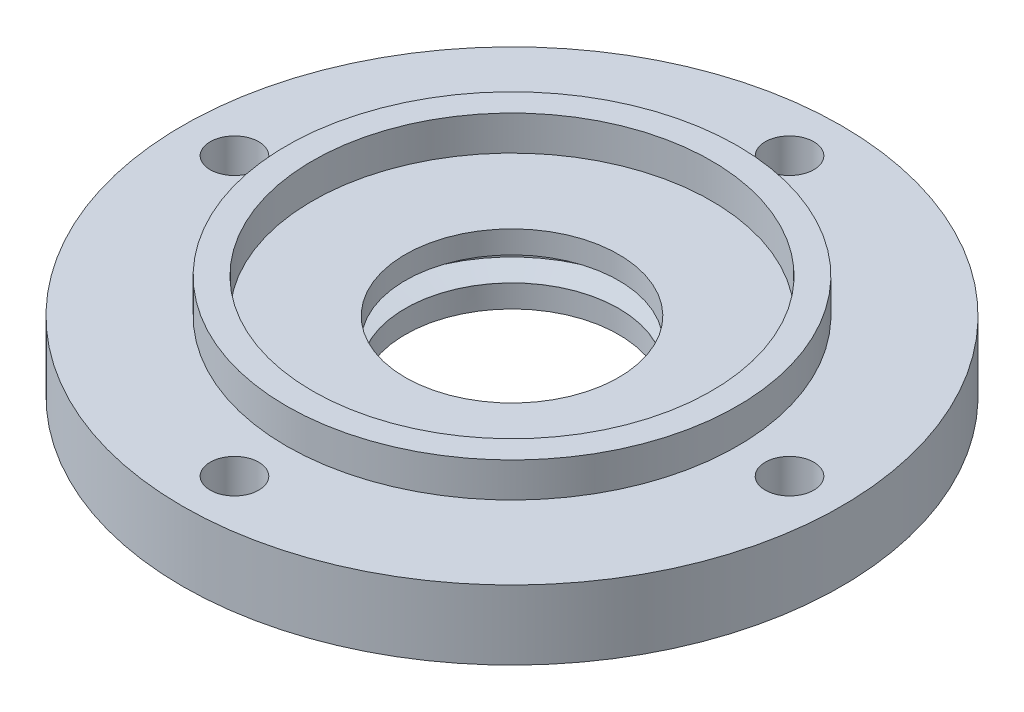
ISO-10303-21;
HEADER;
FILE_DESCRIPTION(('STEP AP214'),'2;1');
FILE_NAME('part.step','',(''),(''),'','','');
FILE_SCHEMA(('AUTOMOTIVE_DESIGN { 1 0 10303 214 1 1 1 1 }'));
ENDSEC;
DATA;
#1=APPLICATION_CONTEXT('core data for automotive mechanical design processes');
#2=APPLICATION_PROTOCOL_DEFINITION('international standard','automotive_design',2000,#1);
#3=PRODUCT_CONTEXT('',#1,'mechanical');
#4=PRODUCT('Part','Part','',(#3));
#5=PRODUCT_RELATED_PRODUCT_CATEGORY('part','',(#4));
#6=PRODUCT_DEFINITION_FORMATION('','',#4);
#7=PRODUCT_DEFINITION_CONTEXT('part definition',#1,'design');
#8=PRODUCT_DEFINITION('design','',#6,#7);
#9=PRODUCT_DEFINITION_SHAPE('','',#8);
#10=(LENGTH_UNIT() NAMED_UNIT(*) SI_UNIT(.MILLI.,.METRE.));
#11=(NAMED_UNIT(*) PLANE_ANGLE_UNIT() SI_UNIT($,.RADIAN.));
#12=(NAMED_UNIT(*) SI_UNIT($,.STERADIAN.) SOLID_ANGLE_UNIT());
#13=UNCERTAINTY_MEASURE_WITH_UNIT(LENGTH_MEASURE(1.E-05),#10,'distance_accuracy_value','');
#14=(GEOMETRIC_REPRESENTATION_CONTEXT(3) GLOBAL_UNCERTAINTY_ASSIGNED_CONTEXT((#13)) GLOBAL_UNIT_ASSIGNED_CONTEXT((#10,
#11,#12)) REPRESENTATION_CONTEXT('',''));
#15=CARTESIAN_POINT('',(0.,0.,0.));
#16=DIRECTION('',(0.,0.,1.));
#17=DIRECTION('',(1.,0.,0.));
#18=AXIS2_PLACEMENT_3D('',#15,#16,#17);
#19=CARTESIAN_POINT('',(0.,-10.,0.));
#20=DIRECTION('',(0.,1.,0.));
#21=DIRECTION('',(0.,0.,1.));
#22=AXIS2_PLACEMENT_3D('',#19,#20,#21);
#23=CYLINDRICAL_SURFACE('',#22,30.75);
#24=CARTESIAN_POINT('',(0.,3.5,0.));
#25=DIRECTION('',(0.,1.,0.));
#26=DIRECTION('',(0.,0.,1.));
#27=AXIS2_PLACEMENT_3D('',#24,#25,#26);
#28=CIRCLE('',#27,30.75);
#29=CARTESIAN_POINT('',(0.,3.49999999999999,30.75));
#30=VERTEX_POINT('',#29);
#31=EDGE_CURVE('E41',#30,#30,#28,.F.);
#32=ORIENTED_EDGE('',*,*,#31,.T.);
#33=EDGE_LOOP('',(#32));
#34=FACE_BOUND('',#33,.T.);
#35=CARTESIAN_POINT('',(0.,10.,0.));
#36=DIRECTION('',(0.,1.,0.));
#37=DIRECTION('',(0.,0.,1.));
#38=AXIS2_PLACEMENT_3D('',#35,#36,#37);
#39=CIRCLE('',#38,30.75);
#40=CARTESIAN_POINT('',(0.,10.,30.75));
#41=VERTEX_POINT('',#40);
#42=EDGE_CURVE('E63',#41,#41,#39,.T.);
#43=ORIENTED_EDGE('',*,*,#42,.T.);
#44=EDGE_LOOP('',(#43));
#45=FACE_BOUND('',#44,.T.);
#46=ADVANCED_FACE('F37',(#34,#45),#23,.F.);
#47=CARTESIAN_POINT('',(0.,10.,0.));
#48=DIRECTION('',(0.,-1.,0.));
#49=DIRECTION('',(0.,0.,-1.));
#50=AXIS2_PLACEMENT_3D('',#47,#48,#49);
#51=CYLINDRICAL_SURFACE('',#50,95.);
#52=CARTESIAN_POINT('',(0.,10.,0.));
#53=DIRECTION('',(0.,1.,0.));
#54=DIRECTION('',(0.,0.,1.));
#55=AXIS2_PLACEMENT_3D('',#52,#53,#54);
#56=CIRCLE('',#55,95.);
#57=CARTESIAN_POINT('',(0.,10.,95.));
#58=VERTEX_POINT('',#57);
#59=EDGE_CURVE('E45',#58,#58,#56,.T.);
#60=ORIENTED_EDGE('',*,*,#59,.F.);
#61=EDGE_LOOP('',(#60));
#62=FACE_BOUND('',#61,.T.);
#63=CARTESIAN_POINT('',(0.,-10.,0.));
#64=DIRECTION('',(0.,1.,0.));
#65=DIRECTION('',(0.,0.,1.));
#66=AXIS2_PLACEMENT_3D('',#63,#64,#65);
#67=CIRCLE('',#66,95.);
#68=CARTESIAN_POINT('',(0.,-10.,95.));
#69=VERTEX_POINT('',#68);
#70=EDGE_CURVE('E50',#69,#69,#67,.T.);
#71=ORIENTED_EDGE('',*,*,#70,.T.);
#72=EDGE_LOOP('',(#71));
#73=FACE_BOUND('',#72,.T.);
#74=ADVANCED_FACE('F39',(#62,#73),#51,.T.);
#75=CARTESIAN_POINT('',(0.,10.,0.));
#76=DIRECTION('',(0.,1.,0.));
#77=DIRECTION('',(0.,0.,1.));
#78=AXIS2_PLACEMENT_3D('',#75,#76,#77);
#79=PLANE('',#78);
#80=CARTESIAN_POINT('',(0.,10.,-80.));
#81=DIRECTION('',(0.,1.,0.));
#82=DIRECTION('',(0.,0.,1.));
#83=AXIS2_PLACEMENT_3D('',#80,#81,#82);
#84=CIRCLE('',#83,7.);
#85=CARTESIAN_POINT('',(0.,10.,-73.));
#86=VERTEX_POINT('',#85);
#87=EDGE_CURVE('E84',#86,#86,#84,.T.);
#88=ORIENTED_EDGE('',*,*,#87,.F.);
#89=EDGE_LOOP('',(#88));
#90=FACE_BOUND('',#89,.T.);
#91=CARTESIAN_POINT('',(80.0000000000023,10.,-2.26393958003914E-12));
#92=DIRECTION('',(0.,1.,0.));
#93=DIRECTION('',(0.,0.,1.));
#94=AXIS2_PLACEMENT_3D('',#91,#92,#93);
#95=CIRCLE('',#94,7.00000000000177);
#96=CARTESIAN_POINT('',(80.0000000000023,10.,6.99999999999951));
#97=VERTEX_POINT('',#96);
#98=EDGE_CURVE('E90',#97,#97,#95,.T.);
#99=ORIENTED_EDGE('',*,*,#98,.F.);
#100=EDGE_LOOP('',(#99));
#101=FACE_BOUND('',#100,.T.);
#102=CARTESIAN_POINT('',(4.52787916007828E-12,10.,80.));
#103=DIRECTION('',(0.,1.,0.));
#104=DIRECTION('',(0.,0.,1.));
#105=AXIS2_PLACEMENT_3D('',#102,#103,#104);
#106=CIRCLE('',#105,7.00000000000487);
#107=CARTESIAN_POINT('',(4.52787916007828E-12,10.,87.0000000000049));
#108=VERTEX_POINT('',#107);
#109=EDGE_CURVE('E96',#108,#108,#106,.T.);
#110=ORIENTED_EDGE('',*,*,#109,.F.);
#111=EDGE_LOOP('',(#110));
#112=FACE_BOUND('',#111,.T.);
#113=CARTESIAN_POINT('',(-79.9999999999977,10.,2.27373675443232E-12));
#114=DIRECTION('',(0.,1.,0.));
#115=DIRECTION('',(0.,0.,1.));
#116=AXIS2_PLACEMENT_3D('',#113,#114,#115);
#117=CIRCLE('',#116,7.00000000000364);
#118=CARTESIAN_POINT('',(-79.9999999999977,10.,7.00000000000591));
#119=VERTEX_POINT('',#118);
#120=EDGE_CURVE('E77',#119,#119,#117,.T.);
#121=ORIENTED_EDGE('',*,*,#120,.F.);
#122=EDGE_LOOP('',(#121));
#123=FACE_BOUND('',#122,.T.);
#124=CARTESIAN_POINT('',(0.,10.,0.));
#125=DIRECTION('',(0.,1.,0.));
#126=DIRECTION('',(0.,0.,1.));
#127=AXIS2_PLACEMENT_3D('',#124,#125,#126);
#128=CIRCLE('',#127,65.);
#129=CARTESIAN_POINT('',(0.,10.,65.));
#130=VERTEX_POINT('',#129);
#131=EDGE_CURVE('E10',#130,#130,#128,.T.);
#132=ORIENTED_EDGE('',*,*,#131,.F.);
#133=EDGE_LOOP('',(#132));
#134=FACE_BOUND('',#133,.T.);
#135=ORIENTED_EDGE('',*,*,#59,.T.);
#136=EDGE_LOOP('',(#135));
#137=FACE_BOUND('',#136,.T.);
#138=ADVANCED_FACE('F126',(#90,#101,#112,#123,#134,#137),#79,.T.);
#139=CARTESIAN_POINT('',(0.,-10.,0.));
#140=DIRECTION('',(0.,1.,0.));
#141=DIRECTION('',(0.,0.,1.));
#142=AXIS2_PLACEMENT_3D('',#139,#140,#141);
#143=PLANE('',#142);
#144=CARTESIAN_POINT('',(0.,-10.,0.));
#145=DIRECTION('',(0.,1.,0.));
#146=DIRECTION('',(0.,0.,1.));
#147=AXIS2_PLACEMENT_3D('',#144,#145,#146);
#148=CIRCLE('',#147,30.75);
#149=CARTESIAN_POINT('',(0.,-10.,30.75));
#150=VERTEX_POINT('',#149);
#151=EDGE_CURVE('E74',#150,#150,#148,.T.);
#152=ORIENTED_EDGE('',*,*,#151,.T.);
#153=EDGE_LOOP('',(#152));
#154=FACE_BOUND('',#153,.T.);
#155=CARTESIAN_POINT('',(0.,-10.,-80.));
#156=DIRECTION('',(0.,1.,0.));
#157=DIRECTION('',(0.,0.,1.));
#158=AXIS2_PLACEMENT_3D('',#155,#156,#157);
#159=CIRCLE('',#158,7.);
#160=CARTESIAN_POINT('',(0.,-10.,-73.));
#161=VERTEX_POINT('',#160);
#162=EDGE_CURVE('E80',#161,#161,#159,.T.);
#163=ORIENTED_EDGE('',*,*,#162,.T.);
#164=EDGE_LOOP('',(#163));
#165=FACE_BOUND('',#164,.T.);
#166=CARTESIAN_POINT('',(80.0000000000023,-10.,-2.26393958003914E-12));
#167=DIRECTION('',(0.,1.,0.));
#168=DIRECTION('',(0.,0.,1.));
#169=AXIS2_PLACEMENT_3D('',#166,#167,#168);
#170=CIRCLE('',#169,7.00000000000177);
#171=CARTESIAN_POINT('',(80.0000000000023,-10.,6.99999999999951));
#172=VERTEX_POINT('',#171);
#173=EDGE_CURVE('E87',#172,#172,#170,.T.);
#174=ORIENTED_EDGE('',*,*,#173,.T.);
#175=EDGE_LOOP('',(#174));
#176=FACE_BOUND('',#175,.T.);
#177=CARTESIAN_POINT('',(4.52787916007828E-12,-10.,80.));
#178=DIRECTION('',(0.,1.,0.));
#179=DIRECTION('',(0.,0.,1.));
#180=AXIS2_PLACEMENT_3D('',#177,#178,#179);
#181=CIRCLE('',#180,7.00000000000487);
#182=CARTESIAN_POINT('',(4.52787916007828E-12,-10.,87.0000000000049));
#183=VERTEX_POINT('',#182);
#184=EDGE_CURVE('E93',#183,#183,#181,.T.);
#185=ORIENTED_EDGE('',*,*,#184,.T.);
#186=EDGE_LOOP('',(#185));
#187=FACE_BOUND('',#186,.T.);
#188=CARTESIAN_POINT('',(-79.9999999999977,-10.,2.27373675443232E-12));
#189=DIRECTION('',(0.,1.,0.));
#190=DIRECTION('',(0.,0.,1.));
#191=AXIS2_PLACEMENT_3D('',#188,#189,#190);
#192=CIRCLE('',#191,7.00000000000364);
#193=CARTESIAN_POINT('',(-79.9999999999977,-10.,7.00000000000591));
#194=VERTEX_POINT('',#193);
#195=EDGE_CURVE('E99',#194,#194,#192,.T.);
#196=ORIENTED_EDGE('',*,*,#195,.T.);
#197=EDGE_LOOP('',(#196));
#198=FACE_BOUND('',#197,.T.);
#199=ORIENTED_EDGE('',*,*,#70,.F.);
#200=EDGE_LOOP('',(#199));
#201=FACE_BOUND('',#200,.T.);
#202=ADVANCED_FACE('F120',(#154,#165,#176,#187,#198,#201),#143,.F.);
#203=CARTESIAN_POINT('',(0.,20.,0.));
#204=DIRECTION('',(0.,-1.,0.));
#205=DIRECTION('',(0.,0.,-1.));
#206=AXIS2_PLACEMENT_3D('',#203,#204,#205);
#207=CYLINDRICAL_SURFACE('',#206,65.);
#208=CARTESIAN_POINT('',(0.,20.,0.));
#209=DIRECTION('',(0.,1.,0.));
#210=DIRECTION('',(0.,0.,1.));
#211=AXIS2_PLACEMENT_3D('',#208,#209,#210);
#212=CIRCLE('',#211,65.);
#213=CARTESIAN_POINT('',(0.,20.,65.));
#214=VERTEX_POINT('',#213);
#215=EDGE_CURVE('E53',#214,#214,#212,.T.);
#216=ORIENTED_EDGE('',*,*,#215,.F.);
#217=EDGE_LOOP('',(#216));
#218=FACE_BOUND('',#217,.T.);
#219=ORIENTED_EDGE('',*,*,#131,.T.);
#220=EDGE_LOOP('',(#219));
#221=FACE_BOUND('',#220,.T.);
#222=ADVANCED_FACE('F114',(#218,#221),#207,.T.);
#223=CARTESIAN_POINT('',(0.,20.,0.));
#224=DIRECTION('',(0.,1.,0.));
#225=DIRECTION('',(0.,0.,1.));
#226=AXIS2_PLACEMENT_3D('',#223,#224,#225);
#227=PLANE('',#226);
#228=CARTESIAN_POINT('',(0.,20.,0.));
#229=DIRECTION('',(0.,1.,0.));
#230=DIRECTION('',(0.,0.,1.));
#231=AXIS2_PLACEMENT_3D('',#228,#229,#230);
#232=CIRCLE('',#231,57.5);
#233=CARTESIAN_POINT('',(0.,20.,57.5));
#234=VERTEX_POINT('',#233);
#235=EDGE_CURVE('E83',#234,#234,#232,.T.);
#236=ORIENTED_EDGE('',*,*,#235,.F.);
#237=EDGE_LOOP('',(#236));
#238=FACE_BOUND('',#237,.T.);
#239=ORIENTED_EDGE('',*,*,#215,.T.);
#240=EDGE_LOOP('',(#239));
#241=FACE_BOUND('',#240,.T.);
#242=ADVANCED_FACE('F111',(#238,#241),#227,.T.);
#243=CARTESIAN_POINT('',(0.,10.,0.));
#244=DIRECTION('',(0.,1.,0.));
#245=DIRECTION('',(0.,0.,1.));
#246=AXIS2_PLACEMENT_3D('',#243,#244,#245);
#247=CYLINDRICAL_SURFACE('',#246,57.5);
#248=CARTESIAN_POINT('',(0.,10.,0.));
#249=DIRECTION('',(0.,1.,0.));
#250=DIRECTION('',(0.,0.,1.));
#251=AXIS2_PLACEMENT_3D('',#248,#249,#250);
#252=CIRCLE('',#251,57.5);
#253=CARTESIAN_POINT('',(0.,10.,57.5));
#254=VERTEX_POINT('',#253);
#255=EDGE_CURVE('E104',#254,#254,#252,.T.);
#256=ORIENTED_EDGE('',*,*,#255,.F.);
#257=EDGE_LOOP('',(#256));
#258=FACE_BOUND('',#257,.T.);
#259=ORIENTED_EDGE('',*,*,#235,.T.);
#260=EDGE_LOOP('',(#259));
#261=FACE_BOUND('',#260,.T.);
#262=ADVANCED_FACE('F109',(#258,#261),#247,.F.);
#263=CARTESIAN_POINT('',(0.,10.,0.));
#264=DIRECTION('',(0.,1.,0.));
#265=DIRECTION('',(0.,0.,1.));
#266=AXIS2_PLACEMENT_3D('',#263,#264,#265);
#267=PLANE('',#266);
#268=ORIENTED_EDGE('',*,*,#42,.F.);
#269=EDGE_LOOP('',(#268));
#270=FACE_BOUND('',#269,.T.);
#271=ORIENTED_EDGE('',*,*,#255,.T.);
#272=EDGE_LOOP('',(#271));
#273=FACE_BOUND('',#272,.T.);
#274=ADVANCED_FACE('F170',(#270,#273),#267,.T.);
#275=CARTESIAN_POINT('',(-79.9999999999977,-10.,2.27373675443232E-12));
#276=DIRECTION('',(0.,1.,0.));
#277=DIRECTION('',(0.,0.,1.));
#278=AXIS2_PLACEMENT_3D('',#275,#276,#277);
#279=CYLINDRICAL_SURFACE('',#278,7.00000000000364);
#280=ORIENTED_EDGE('',*,*,#195,.F.);
#281=EDGE_LOOP('',(#280));
#282=FACE_BOUND('',#281,.T.);
#283=ORIENTED_EDGE('',*,*,#120,.T.);
#284=EDGE_LOOP('',(#283));
#285=FACE_BOUND('',#284,.T.);
#286=ADVANCED_FACE('F166',(#282,#285),#279,.F.);
#287=CARTESIAN_POINT('',(4.52787916007828E-12,-10.,80.));
#288=DIRECTION('',(0.,1.,0.));
#289=DIRECTION('',(0.,0.,1.));
#290=AXIS2_PLACEMENT_3D('',#287,#288,#289);
#291=CYLINDRICAL_SURFACE('',#290,7.00000000000487);
#292=ORIENTED_EDGE('',*,*,#184,.F.);
#293=EDGE_LOOP('',(#292));
#294=FACE_BOUND('',#293,.T.);
#295=ORIENTED_EDGE('',*,*,#109,.T.);
#296=EDGE_LOOP('',(#295));
#297=FACE_BOUND('',#296,.T.);
#298=ADVANCED_FACE('F169',(#294,#297),#291,.F.);
#299=CARTESIAN_POINT('',(80.0000000000023,-10.,-2.26393958003914E-12));
#300=DIRECTION('',(0.,1.,0.));
#301=DIRECTION('',(0.,0.,1.));
#302=AXIS2_PLACEMENT_3D('',#299,#300,#301);
#303=CYLINDRICAL_SURFACE('',#302,7.00000000000177);
#304=ORIENTED_EDGE('',*,*,#173,.F.);
#305=EDGE_LOOP('',(#304));
#306=FACE_BOUND('',#305,.T.);
#307=ORIENTED_EDGE('',*,*,#98,.T.);
#308=EDGE_LOOP('',(#307));
#309=FACE_BOUND('',#308,.T.);
#310=ADVANCED_FACE('F150',(#306,#309),#303,.F.);
#311=CARTESIAN_POINT('',(0.,-10.,-80.));
#312=DIRECTION('',(0.,1.,0.));
#313=DIRECTION('',(0.,0.,1.));
#314=AXIS2_PLACEMENT_3D('',#311,#312,#313);
#315=CYLINDRICAL_SURFACE('',#314,7.);
#316=ORIENTED_EDGE('',*,*,#162,.F.);
#317=EDGE_LOOP('',(#316));
#318=FACE_BOUND('',#317,.T.);
#319=ORIENTED_EDGE('',*,*,#87,.T.);
#320=EDGE_LOOP('',(#319));
#321=FACE_BOUND('',#320,.T.);
#322=ADVANCED_FACE('F143',(#318,#321),#315,.F.);
#323=CARTESIAN_POINT('',(0.,-3.5,0.));
#324=DIRECTION('',(0.,-1.,0.));
#325=DIRECTION('',(0.,0.,-1.));
#326=AXIS2_PLACEMENT_3D('',#323,#324,#325);
#327=CIRCLE('',#326,30.75);
#328=CARTESIAN_POINT('',(0.,-3.49999999999998,-30.75));
#329=VERTEX_POINT('',#328);
#330=EDGE_CURVE('E57',#329,#329,#327,.F.);
#331=ORIENTED_EDGE('',*,*,#330,.T.);
#332=EDGE_LOOP('',(#331));
#333=FACE_BOUND('',#332,.T.);
#334=ORIENTED_EDGE('',*,*,#151,.F.);
#335=EDGE_LOOP('',(#334));
#336=FACE_BOUND('',#335,.T.);
#337=ADVANCED_FACE('F132',(#333,#336),#23,.F.);
#338=CARTESIAN_POINT('',(0.,3.5,0.));
#339=DIRECTION('',(0.,1.,0.));
#340=DIRECTION('',(0.,0.,1.));
#341=AXIS2_PLACEMENT_3D('',#338,#339,#340);
#342=PLANE('',#341);
#343=CARTESIAN_POINT('',(0.,3.50000000000001,0.));
#344=DIRECTION('',(0.,1.,0.));
#345=DIRECTION('',(0.,0.,1.));
#346=AXIS2_PLACEMENT_3D('',#343,#344,#345);
#347=CIRCLE('',#346,30.8147869255303);
#348=CARTESIAN_POINT('',(0.,3.5,30.8147869255303));
#349=VERTEX_POINT('',#348);
#350=EDGE_CURVE('E59',#349,#349,#347,.T.);
#351=ORIENTED_EDGE('',*,*,#350,.F.);
#352=EDGE_LOOP('',(#351));
#353=FACE_BOUND('',#352,.T.);
#354=ORIENTED_EDGE('',*,*,#31,.F.);
#355=EDGE_LOOP('',(#354));
#356=FACE_BOUND('',#355,.T.);
#357=ADVANCED_FACE('F142',(#353,#356),#342,.F.);
#358=CARTESIAN_POINT('',(0.,-3.5,0.));
#359=DIRECTION('',(0.,-1.,0.));
#360=DIRECTION('',(0.,0.,-1.));
#361=AXIS2_PLACEMENT_3D('',#358,#359,#360);
#362=PLANE('',#361);
#363=CARTESIAN_POINT('',(0.,-3.49999999999999,0.));
#364=DIRECTION('',(0.,1.,0.));
#365=DIRECTION('',(0.,0.,1.));
#366=AXIS2_PLACEMENT_3D('',#363,#364,#365);
#367=CIRCLE('',#366,30.8147869255303);
#368=CARTESIAN_POINT('',(0.,-3.5,30.8147869255303));
#369=VERTEX_POINT('',#368);
#370=EDGE_CURVE('E65',#369,#369,#367,.T.);
#371=ORIENTED_EDGE('',*,*,#370,.T.);
#372=EDGE_LOOP('',(#371));
#373=FACE_BOUND('',#372,.T.);
#374=ORIENTED_EDGE('',*,*,#330,.F.);
#375=EDGE_LOOP('',(#374));
#376=FACE_BOUND('',#375,.T.);
#377=ADVANCED_FACE('F147',(#373,#376),#362,.F.);
#378=CARTESIAN_POINT('',(0.,3.50000000000001,0.));
#379=DIRECTION('',(0.,-1.,0.));
#380=DIRECTION('',(0.,0.,-1.));
#381=AXIS2_PLACEMENT_3D('',#378,#379,#380);
#382=CONICAL_SURFACE('',#381,30.8147869255303,1.44140330928943);
#383=CARTESIAN_POINT('',(0.,2.50000000000001,0.));
#384=DIRECTION('',(0.,1.,0.));
#385=DIRECTION('',(0.,0.,1.));
#386=AXIS2_PLACEMENT_3D('',#383,#384,#385);
#387=CIRCLE('',#386,38.5);
#388=CARTESIAN_POINT('',(0.,2.5,38.5));
#389=VERTEX_POINT('',#388);
#390=EDGE_CURVE('E319',#389,#389,#387,.T.);
#391=ORIENTED_EDGE('',*,*,#390,.F.);
#392=EDGE_LOOP('',(#391));
#393=FACE_BOUND('',#392,.T.);
#394=ORIENTED_EDGE('',*,*,#350,.T.);
#395=EDGE_LOOP('',(#394));
#396=FACE_BOUND('',#395,.T.);
#397=ADVANCED_FACE('F281',(#393,#396),#382,.F.);
#398=CARTESIAN_POINT('',(0.,-2.49999999999999,0.));
#399=DIRECTION('',(0.,1.,0.));
#400=DIRECTION('',(0.,0.,1.));
#401=AXIS2_PLACEMENT_3D('',#398,#399,#400);
#402=CONICAL_SURFACE('',#401,38.5,1.44140330928943);
#403=ORIENTED_EDGE('',*,*,#370,.F.);
#404=EDGE_LOOP('',(#403));
#405=FACE_BOUND('',#404,.T.);
#406=CARTESIAN_POINT('',(0.,-2.49999999999999,0.));
#407=DIRECTION('',(0.,1.,0.));
#408=DIRECTION('',(0.,0.,1.));
#409=AXIS2_PLACEMENT_3D('',#406,#407,#408);
#410=CIRCLE('',#409,38.5);
#411=CARTESIAN_POINT('',(0.,-2.50000000000001,38.5));
#412=VERTEX_POINT('',#411);
#413=EDGE_CURVE('E70',#412,#412,#410,.T.);
#414=ORIENTED_EDGE('',*,*,#413,.T.);
#415=EDGE_LOOP('',(#414));
#416=FACE_BOUND('',#415,.T.);
#417=ADVANCED_FACE('F290',(#405,#416),#402,.F.);
#418=CARTESIAN_POINT('',(0.,3.5,0.));
#419=DIRECTION('',(0.,1.,0.));
#420=DIRECTION('',(0.,0.,1.));
#421=AXIS2_PLACEMENT_3D('',#418,#419,#420);
#422=CYLINDRICAL_SURFACE('',#421,38.5);
#423=ORIENTED_EDGE('',*,*,#413,.F.);
#424=EDGE_LOOP('',(#423));
#425=FACE_BOUND('',#424,.T.);
#426=ORIENTED_EDGE('',*,*,#390,.T.);
#427=EDGE_LOOP('',(#426));
#428=FACE_BOUND('',#427,.T.);
#429=ADVANCED_FACE('F298',(#425,#428),#422,.F.);
#430=CLOSED_SHELL('',(#46,#74,#138,#202,#222,#242,#262,#274,#286,#298,#310,#322,#337,#357,#377,
#397,#417,#429));
#431=MANIFOLD_SOLID_BREP('B2',#430);
#432=ADVANCED_BREP_SHAPE_REPRESENTATION('',(#18,#431),#14);
#433=SHAPE_DEFINITION_REPRESENTATION(#9,#432);
ENDSEC;
END-ISO-10303-21;
